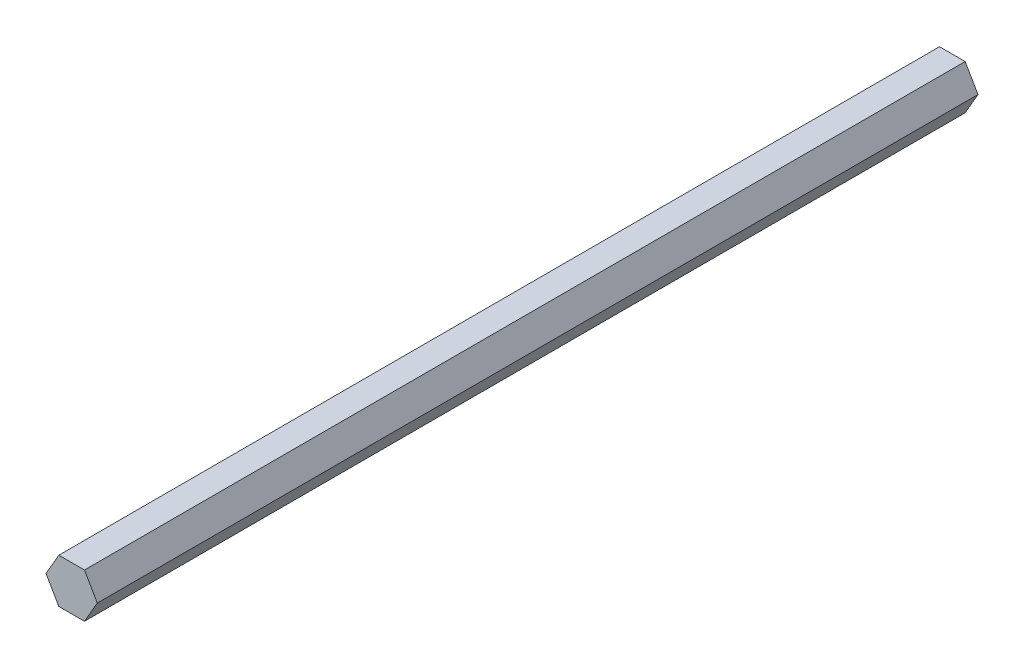
ISO-10303-21;
HEADER;
FILE_DESCRIPTION(('STEP AP214'),'2;1');
FILE_NAME('part.step','',(''),(''),'','','');
FILE_SCHEMA(('AUTOMOTIVE_DESIGN { 1 0 10303 214 1 1 1 1 }'));
ENDSEC;
DATA;
#1=APPLICATION_CONTEXT('core data for automotive mechanical design processes');
#2=APPLICATION_PROTOCOL_DEFINITION('international standard','automotive_design',2000,#1);
#3=PRODUCT_CONTEXT('',#1,'mechanical');
#4=PRODUCT('Part','Part','',(#3));
#5=PRODUCT_RELATED_PRODUCT_CATEGORY('part','',(#4));
#6=PRODUCT_DEFINITION_FORMATION('','',#4);
#7=PRODUCT_DEFINITION_CONTEXT('part definition',#1,'design');
#8=PRODUCT_DEFINITION('design','',#6,#7);
#9=PRODUCT_DEFINITION_SHAPE('','',#8);
#10=(LENGTH_UNIT() NAMED_UNIT(*) SI_UNIT(.MILLI.,.METRE.));
#11=(NAMED_UNIT(*) PLANE_ANGLE_UNIT() SI_UNIT($,.RADIAN.));
#12=(NAMED_UNIT(*) SI_UNIT($,.STERADIAN.) SOLID_ANGLE_UNIT());
#13=UNCERTAINTY_MEASURE_WITH_UNIT(LENGTH_MEASURE(1.E-05),#10,'distance_accuracy_value','');
#14=(GEOMETRIC_REPRESENTATION_CONTEXT(3) GLOBAL_UNCERTAINTY_ASSIGNED_CONTEXT((#13)) GLOBAL_UNIT_ASSIGNED_CONTEXT((#10,
#11,#12)) REPRESENTATION_CONTEXT('',''));
#15=CARTESIAN_POINT('',(0.,0.,0.));
#16=DIRECTION('',(0.,0.,1.));
#17=DIRECTION('',(1.,0.,0.));
#18=AXIS2_PLACEMENT_3D('',#15,#16,#17);
#19=CARTESIAN_POINT('',(0.499407982849026,-0.865,34.3));
#20=DIRECTION('',(-0.866025403784439,0.5,0.));
#21=DIRECTION('',(-0.5,-0.866025403784439,0.));
#22=AXIS2_PLACEMENT_3D('',#19,#20,#21);
#23=PLANE('',#22);
#24=DIRECTION('',(0.5,0.866025403784439,0.));
#25=VECTOR('',#24,1.);
#26=CARTESIAN_POINT('',(0.499407982849026,-0.865,0.));
#27=LINE('',#26,#25);
#28=CARTESIAN_POINT('',(0.499407982849026,-0.865,0.));
#29=VERTEX_POINT('',#28);
#30=CARTESIAN_POINT('',(0.998815965698053,0.,0.));
#31=VERTEX_POINT('',#30);
#32=EDGE_CURVE('E119',#29,#31,#27,.T.);
#33=ORIENTED_EDGE('',*,*,#32,.T.);
#34=DIRECTION('',(0.,0.,-1.));
#35=VECTOR('',#34,1.);
#36=CARTESIAN_POINT('',(0.998815965698053,0.,34.3));
#37=LINE('',#36,#35);
#38=CARTESIAN_POINT('',(0.998815965698053,0.,34.3));
#39=VERTEX_POINT('',#38);
#40=EDGE_CURVE('E11',#39,#31,#37,.T.);
#41=ORIENTED_EDGE('',*,*,#40,.F.);
#42=DIRECTION('',(0.5,0.866025403784439,0.));
#43=VECTOR('',#42,1.);
#44=CARTESIAN_POINT('',(0.499407982849026,-0.865,34.3));
#45=LINE('',#44,#43);
#46=CARTESIAN_POINT('',(0.499407982849026,-0.865,34.3));
#47=VERTEX_POINT('',#46);
#48=EDGE_CURVE('E129',#47,#39,#45,.T.);
#49=ORIENTED_EDGE('',*,*,#48,.F.);
#50=DIRECTION('',(0.,0.,-1.));
#51=VECTOR('',#50,1.);
#52=CARTESIAN_POINT('',(0.499407982849026,-0.865,34.3));
#53=LINE('',#52,#51);
#54=EDGE_CURVE('E115',#47,#29,#53,.T.);
#55=ORIENTED_EDGE('',*,*,#54,.T.);
#56=EDGE_LOOP('',(#33,#41,#49,#55));
#57=FACE_BOUND('',#56,.T.);
#58=ADVANCED_FACE('F35',(#57),#23,.F.);
#59=CARTESIAN_POINT('',(0.998815965698053,0.,34.3));
#60=DIRECTION('',(-0.866025403784439,-0.5,0.));
#61=DIRECTION('',(0.5,-0.866025403784439,0.));
#62=AXIS2_PLACEMENT_3D('',#59,#60,#61);
#63=PLANE('',#62);
#64=DIRECTION('',(-0.5,0.866025403784439,0.));
#65=VECTOR('',#64,1.);
#66=CARTESIAN_POINT('',(0.998815965698053,0.,0.));
#67=LINE('',#66,#65);
#68=CARTESIAN_POINT('',(0.499407982849027,0.865,0.));
#69=VERTEX_POINT('',#68);
#70=EDGE_CURVE('E122',#31,#69,#67,.T.);
#71=ORIENTED_EDGE('',*,*,#70,.T.);
#72=DIRECTION('',(0.,0.,-1.));
#73=VECTOR('',#72,1.);
#74=CARTESIAN_POINT('',(0.499407982849027,0.865,34.3));
#75=LINE('',#74,#73);
#76=CARTESIAN_POINT('',(0.499407982849027,0.865,34.3));
#77=VERTEX_POINT('',#76);
#78=EDGE_CURVE('E43',#77,#69,#75,.T.);
#79=ORIENTED_EDGE('',*,*,#78,.F.);
#80=DIRECTION('',(-0.5,0.866025403784439,0.));
#81=VECTOR('',#80,1.);
#82=CARTESIAN_POINT('',(0.998815965698053,0.,34.3));
#83=LINE('',#82,#81);
#84=EDGE_CURVE('E88',#39,#77,#83,.T.);
#85=ORIENTED_EDGE('',*,*,#84,.F.);
#86=ORIENTED_EDGE('',*,*,#40,.T.);
#87=EDGE_LOOP('',(#71,#79,#85,#86));
#88=FACE_BOUND('',#87,.T.);
#89=ADVANCED_FACE('F153',(#88),#63,.F.);
#90=CARTESIAN_POINT('',(0.499407982849027,0.865,34.3));
#91=DIRECTION('',(0.,-1.,0.));
#92=DIRECTION('',(1.,0.,0.));
#93=AXIS2_PLACEMENT_3D('',#90,#91,#92);
#94=PLANE('',#93);
#95=DIRECTION('',(-1.,0.,0.));
#96=VECTOR('',#95,1.);
#97=CARTESIAN_POINT('',(0.499407982849027,0.865,0.));
#98=LINE('',#97,#96);
#99=CARTESIAN_POINT('',(-0.499407982849026,0.865,0.));
#100=VERTEX_POINT('',#99);
#101=EDGE_CURVE('E124',#69,#100,#98,.T.);
#102=ORIENTED_EDGE('',*,*,#101,.T.);
#103=DIRECTION('',(0.,0.,-1.));
#104=VECTOR('',#103,1.);
#105=CARTESIAN_POINT('',(-0.499407982849026,0.865,34.3));
#106=LINE('',#105,#104);
#107=CARTESIAN_POINT('',(-0.499407982849026,0.865,34.3));
#108=VERTEX_POINT('',#107);
#109=EDGE_CURVE('E110',#108,#100,#106,.T.);
#110=ORIENTED_EDGE('',*,*,#109,.F.);
#111=DIRECTION('',(-1.,0.,0.));
#112=VECTOR('',#111,1.);
#113=CARTESIAN_POINT('',(0.499407982849027,0.865,34.3));
#114=LINE('',#113,#112);
#115=EDGE_CURVE('E101',#77,#108,#114,.T.);
#116=ORIENTED_EDGE('',*,*,#115,.F.);
#117=ORIENTED_EDGE('',*,*,#78,.T.);
#118=EDGE_LOOP('',(#102,#110,#116,#117));
#119=FACE_BOUND('',#118,.T.);
#120=ADVANCED_FACE('F135',(#119),#94,.F.);
#121=CARTESIAN_POINT('',(-0.499407982849026,0.865,34.3));
#122=DIRECTION('',(0.866025403784438,-0.5,0.));
#123=DIRECTION('',(0.5,0.866025403784439,0.));
#124=AXIS2_PLACEMENT_3D('',#121,#122,#123);
#125=PLANE('',#124);
#126=DIRECTION('',(-0.5,-0.866025403784438,0.));
#127=VECTOR('',#126,1.);
#128=CARTESIAN_POINT('',(-0.499407982849026,0.865,0.));
#129=LINE('',#128,#127);
#130=CARTESIAN_POINT('',(-0.998815965698053,0.,0.));
#131=VERTEX_POINT('',#130);
#132=EDGE_CURVE('E109',#100,#131,#129,.T.);
#133=ORIENTED_EDGE('',*,*,#132,.T.);
#134=DIRECTION('',(0.,0.,-1.));
#135=VECTOR('',#134,1.);
#136=CARTESIAN_POINT('',(-0.998815965698053,0.,34.3));
#137=LINE('',#136,#135);
#138=CARTESIAN_POINT('',(-0.998815965698053,0.,34.3));
#139=VERTEX_POINT('',#138);
#140=EDGE_CURVE('E106',#139,#131,#137,.T.);
#141=ORIENTED_EDGE('',*,*,#140,.F.);
#142=DIRECTION('',(-0.5,-0.866025403784438,0.));
#143=VECTOR('',#142,1.);
#144=CARTESIAN_POINT('',(-0.499407982849026,0.865,34.3));
#145=LINE('',#144,#143);
#146=EDGE_CURVE('E95',#108,#139,#145,.T.);
#147=ORIENTED_EDGE('',*,*,#146,.F.);
#148=ORIENTED_EDGE('',*,*,#109,.T.);
#149=EDGE_LOOP('',(#133,#141,#147,#148));
#150=FACE_BOUND('',#149,.T.);
#151=ADVANCED_FACE('F107',(#150),#125,.F.);
#152=CARTESIAN_POINT('',(-0.998815965698053,0.,34.3));
#153=DIRECTION('',(0.866025403784439,0.5,0.));
#154=DIRECTION('',(-0.5,0.866025403784439,0.));
#155=AXIS2_PLACEMENT_3D('',#152,#153,#154);
#156=PLANE('',#155);
#157=DIRECTION('',(0.5,-0.866025403784439,0.));
#158=VECTOR('',#157,1.);
#159=CARTESIAN_POINT('',(-0.998815965698053,0.,0.));
#160=LINE('',#159,#158);
#161=CARTESIAN_POINT('',(-0.499407982849027,-0.865,0.));
#162=VERTEX_POINT('',#161);
#163=EDGE_CURVE('E74',#131,#162,#160,.T.);
#164=ORIENTED_EDGE('',*,*,#163,.T.);
#165=DIRECTION('',(0.,0.,-1.));
#166=VECTOR('',#165,1.);
#167=CARTESIAN_POINT('',(-0.499407982849027,-0.865,34.3));
#168=LINE('',#167,#166);
#169=CARTESIAN_POINT('',(-0.499407982849027,-0.865,34.3));
#170=VERTEX_POINT('',#169);
#171=EDGE_CURVE('E111',#170,#162,#168,.T.);
#172=ORIENTED_EDGE('',*,*,#171,.F.);
#173=DIRECTION('',(0.5,-0.866025403784439,0.));
#174=VECTOR('',#173,1.);
#175=CARTESIAN_POINT('',(-0.998815965698053,0.,34.3));
#176=LINE('',#175,#174);
#177=EDGE_CURVE('E99',#139,#170,#176,.T.);
#178=ORIENTED_EDGE('',*,*,#177,.F.);
#179=ORIENTED_EDGE('',*,*,#140,.T.);
#180=EDGE_LOOP('',(#164,#172,#178,#179));
#181=FACE_BOUND('',#180,.T.);
#182=ADVANCED_FACE('F113',(#181),#156,.F.);
#183=CARTESIAN_POINT('',(-0.499407982849027,-0.865,34.3));
#184=DIRECTION('',(0.,1.,0.));
#185=DIRECTION('',(0.,0.,1.));
#186=AXIS2_PLACEMENT_3D('',#183,#184,#185);
#187=PLANE('',#186);
#188=DIRECTION('',(1.,0.,0.));
#189=VECTOR('',#188,1.);
#190=CARTESIAN_POINT('',(-0.499407982849027,-0.865,0.));
#191=LINE('',#190,#189);
#192=EDGE_CURVE('E80',#162,#29,#191,.T.);
#193=ORIENTED_EDGE('',*,*,#192,.T.);
#194=ORIENTED_EDGE('',*,*,#54,.F.);
#195=DIRECTION('',(1.,0.,0.));
#196=VECTOR('',#195,1.);
#197=CARTESIAN_POINT('',(-0.499407982849027,-0.865,34.3));
#198=LINE('',#197,#196);
#199=EDGE_CURVE('E51',#170,#47,#198,.T.);
#200=ORIENTED_EDGE('',*,*,#199,.F.);
#201=ORIENTED_EDGE('',*,*,#171,.T.);
#202=EDGE_LOOP('',(#193,#194,#200,#201));
#203=FACE_BOUND('',#202,.T.);
#204=ADVANCED_FACE('F142',(#203),#187,.F.);
#205=CARTESIAN_POINT('',(0.,0.,34.3));
#206=DIRECTION('',(0.,0.,1.));
#207=DIRECTION('',(1.,0.,0.));
#208=AXIS2_PLACEMENT_3D('',#205,#206,#207);
#209=PLANE('',#208);
#210=ORIENTED_EDGE('',*,*,#48,.T.);
#211=ORIENTED_EDGE('',*,*,#84,.T.);
#212=ORIENTED_EDGE('',*,*,#115,.T.);
#213=ORIENTED_EDGE('',*,*,#146,.T.);
#214=ORIENTED_EDGE('',*,*,#177,.T.);
#215=ORIENTED_EDGE('',*,*,#199,.T.);
#216=EDGE_LOOP('',(#210,#211,#212,#213,#214,#215));
#217=FACE_BOUND('',#216,.T.);
#218=ADVANCED_FACE('F97',(#217),#209,.T.);
#219=CARTESIAN_POINT('',(0.,0.,0.));
#220=DIRECTION('',(0.,0.,1.));
#221=DIRECTION('',(1.,0.,0.));
#222=AXIS2_PLACEMENT_3D('',#219,#220,#221);
#223=PLANE('',#222);
#224=ORIENTED_EDGE('',*,*,#32,.F.);
#225=ORIENTED_EDGE('',*,*,#192,.F.);
#226=ORIENTED_EDGE('',*,*,#163,.F.);
#227=ORIENTED_EDGE('',*,*,#132,.F.);
#228=ORIENTED_EDGE('',*,*,#101,.F.);
#229=ORIENTED_EDGE('',*,*,#70,.F.);
#230=EDGE_LOOP('',(#224,#225,#226,#227,#228,#229));
#231=FACE_BOUND('',#230,.T.);
#232=ADVANCED_FACE('F138',(#231),#223,.F.);
#233=CLOSED_SHELL('',(#58,#89,#120,#151,#182,#204,#218,#232));
#234=MANIFOLD_SOLID_BREP('B2',#233);
#235=ADVANCED_BREP_SHAPE_REPRESENTATION('',(#18,#234),#14);
#236=SHAPE_DEFINITION_REPRESENTATION(#9,#235);
ENDSEC;
END-ISO-10303-21;
